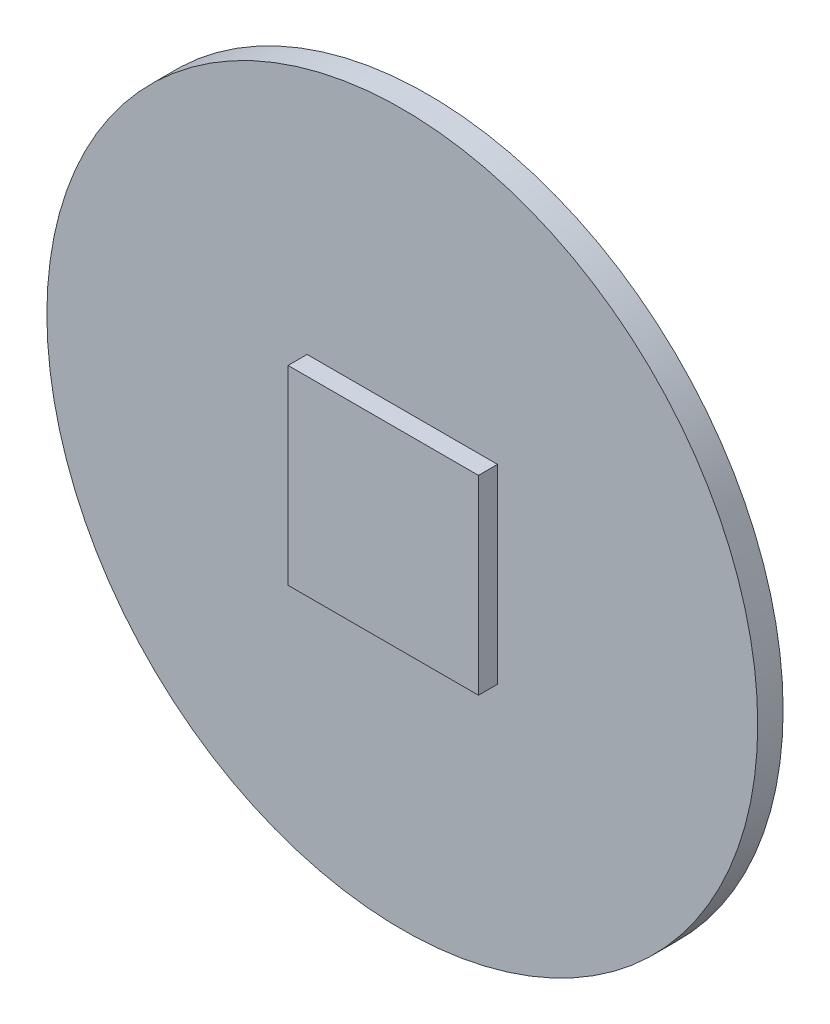
ISO-10303-21;
HEADER;
FILE_DESCRIPTION(('STEP AP214'),'2;1');
FILE_NAME('part.step','',(''),(''),'','','');
FILE_SCHEMA(('AUTOMOTIVE_DESIGN { 1 0 10303 214 1 1 1 1 }'));
ENDSEC;
DATA;
#1=APPLICATION_CONTEXT('core data for automotive mechanical design processes');
#2=APPLICATION_PROTOCOL_DEFINITION('international standard','automotive_design',2000,#1);
#3=PRODUCT_CONTEXT('',#1,'mechanical');
#4=PRODUCT('Part','Part','',(#3));
#5=PRODUCT_RELATED_PRODUCT_CATEGORY('part','',(#4));
#6=PRODUCT_DEFINITION_FORMATION('','',#4);
#7=PRODUCT_DEFINITION_CONTEXT('part definition',#1,'design');
#8=PRODUCT_DEFINITION('design','',#6,#7);
#9=PRODUCT_DEFINITION_SHAPE('','',#8);
#10=(LENGTH_UNIT() NAMED_UNIT(*) SI_UNIT(.MILLI.,.METRE.));
#11=(NAMED_UNIT(*) PLANE_ANGLE_UNIT() SI_UNIT($,.RADIAN.));
#12=(NAMED_UNIT(*) SI_UNIT($,.STERADIAN.) SOLID_ANGLE_UNIT());
#13=UNCERTAINTY_MEASURE_WITH_UNIT(LENGTH_MEASURE(1.E-05),#10,'distance_accuracy_value','');
#14=(GEOMETRIC_REPRESENTATION_CONTEXT(3) GLOBAL_UNCERTAINTY_ASSIGNED_CONTEXT((#13)) GLOBAL_UNIT_ASSIGNED_CONTEXT((#10,
#11,#12)) REPRESENTATION_CONTEXT('',''));
#15=CARTESIAN_POINT('',(0.,0.,0.));
#16=DIRECTION('',(0.,0.,1.));
#17=DIRECTION('',(1.,0.,0.));
#18=AXIS2_PLACEMENT_3D('',#15,#16,#17);
#19=CARTESIAN_POINT('',(0.,0.,0.));
#20=DIRECTION('',(0.,0.,1.));
#21=DIRECTION('',(1.,0.,0.));
#22=AXIS2_PLACEMENT_3D('',#19,#20,#21);
#23=PLANE('',#22);
#24=DIRECTION('',(0.,1.,0.));
#25=VECTOR('',#24,1.);
#26=CARTESIAN_POINT('',(-24.,-10.,0.));
#27=LINE('',#26,#25);
#28=CARTESIAN_POINT('',(-24.,-10.,0.));
#29=VERTEX_POINT('',#28);
#30=CARTESIAN_POINT('',(-24.,10.,0.));
#31=VERTEX_POINT('',#30);
#32=EDGE_CURVE('E143',#29,#31,#27,.T.);
#33=ORIENTED_EDGE('',*,*,#32,.F.);
#34=DIRECTION('',(-1.,0.,0.));
#35=VECTOR('',#34,1.);
#36=CARTESIAN_POINT('',(-14.,-10.,0.));
#37=LINE('',#36,#35);
#38=CARTESIAN_POINT('',(-14.,-10.,0.));
#39=VERTEX_POINT('',#38);
#40=EDGE_CURVE('E156',#39,#29,#37,.T.);
#41=ORIENTED_EDGE('',*,*,#40,.F.);
#42=DIRECTION('',(0.,-1.,0.));
#43=VECTOR('',#42,1.);
#44=CARTESIAN_POINT('',(-14.,-10.,0.));
#45=LINE('',#44,#43);
#46=CARTESIAN_POINT('',(-14.,10.,0.));
#47=VERTEX_POINT('',#46);
#48=EDGE_CURVE('E165',#47,#39,#45,.T.);
#49=ORIENTED_EDGE('',*,*,#48,.F.);
#50=DIRECTION('',(1.,0.,0.));
#51=VECTOR('',#50,1.);
#52=CARTESIAN_POINT('',(-14.,10.,0.));
#53=LINE('',#52,#51);
#54=EDGE_CURVE('E146',#31,#47,#53,.T.);
#55=ORIENTED_EDGE('',*,*,#54,.F.);
#56=EDGE_LOOP('',(#33,#41,#49,#55));
#57=FACE_BOUND('',#56,.T.);
#58=CARTESIAN_POINT('',(0.,0.,0.));
#59=DIRECTION('',(0.,0.,1.));
#60=DIRECTION('',(1.,0.,0.));
#61=AXIS2_PLACEMENT_3D('',#58,#59,#60);
#62=CIRCLE('',#61,28.);
#63=CARTESIAN_POINT('',(28.,0.,0.));
#64=VERTEX_POINT('',#63);
#65=EDGE_CURVE('E37',#64,#64,#62,.T.);
#66=ORIENTED_EDGE('',*,*,#65,.F.);
#67=EDGE_LOOP('',(#66));
#68=FACE_BOUND('',#67,.T.);
#69=DIRECTION('',(0.,1.,0.));
#70=VECTOR('',#69,1.);
#71=CARTESIAN_POINT('',(-7.5,-7.5,0.));
#72=LINE('',#71,#70);
#73=CARTESIAN_POINT('',(-7.5,-7.5,0.));
#74=VERTEX_POINT('',#73);
#75=CARTESIAN_POINT('',(-7.5,7.5,0.));
#76=VERTEX_POINT('',#75);
#77=EDGE_CURVE('E142',#74,#76,#72,.T.);
#78=ORIENTED_EDGE('',*,*,#77,.F.);
#79=DIRECTION('',(-1.,0.,0.));
#80=VECTOR('',#79,1.);
#81=CARTESIAN_POINT('',(7.5,-7.5,0.));
#82=LINE('',#81,#80);
#83=CARTESIAN_POINT('',(7.5,-7.5,0.));
#84=VERTEX_POINT('',#83);
#85=EDGE_CURVE('E139',#84,#74,#82,.T.);
#86=ORIENTED_EDGE('',*,*,#85,.F.);
#87=DIRECTION('',(0.,-1.,0.));
#88=VECTOR('',#87,1.);
#89=CARTESIAN_POINT('',(7.5,-7.5,0.));
#90=LINE('',#89,#88);
#91=CARTESIAN_POINT('',(7.5,7.5,0.));
#92=VERTEX_POINT('',#91);
#93=EDGE_CURVE('E53',#92,#84,#90,.T.);
#94=ORIENTED_EDGE('',*,*,#93,.F.);
#95=DIRECTION('',(1.,0.,0.));
#96=VECTOR('',#95,1.);
#97=CARTESIAN_POINT('',(7.5,7.5,0.));
#98=LINE('',#97,#96);
#99=EDGE_CURVE('E48',#76,#92,#98,.T.);
#100=ORIENTED_EDGE('',*,*,#99,.F.);
#101=EDGE_LOOP('',(#78,#86,#94,#100));
#102=FACE_BOUND('',#101,.T.);
#103=ADVANCED_FACE('F33',(#57,#68,#102),#23,.F.);
#104=CARTESIAN_POINT('',(0.,0.,2.));
#105=DIRECTION('',(0.,0.,-1.));
#106=DIRECTION('',(-1.,0.,0.));
#107=AXIS2_PLACEMENT_3D('',#104,#105,#106);
#108=CYLINDRICAL_SURFACE('',#107,28.);
#109=CARTESIAN_POINT('',(0.,0.,2.));
#110=DIRECTION('',(0.,0.,1.));
#111=DIRECTION('',(1.,0.,0.));
#112=AXIS2_PLACEMENT_3D('',#109,#110,#111);
#113=CIRCLE('',#112,28.);
#114=CARTESIAN_POINT('',(28.,0.,2.));
#115=VERTEX_POINT('',#114);
#116=EDGE_CURVE('E11',#115,#115,#113,.T.);
#117=ORIENTED_EDGE('',*,*,#116,.F.);
#118=EDGE_LOOP('',(#117));
#119=FACE_BOUND('',#118,.T.);
#120=ORIENTED_EDGE('',*,*,#65,.T.);
#121=EDGE_LOOP('',(#120));
#122=FACE_BOUND('',#121,.T.);
#123=ADVANCED_FACE('F35',(#119,#122),#108,.T.);
#124=CARTESIAN_POINT('',(0.,0.,2.));
#125=DIRECTION('',(0.,0.,1.));
#126=DIRECTION('',(1.,0.,0.));
#127=AXIS2_PLACEMENT_3D('',#124,#125,#126);
#128=PLANE('',#127);
#129=DIRECTION('',(0.,1.,0.));
#130=VECTOR('',#129,1.);
#131=CARTESIAN_POINT('',(7.5,-7.5,2.));
#132=LINE('',#131,#130);
#133=CARTESIAN_POINT('',(7.5,-7.5,2.));
#134=VERTEX_POINT('',#133);
#135=CARTESIAN_POINT('',(7.5,7.5,2.));
#136=VERTEX_POINT('',#135);
#137=EDGE_CURVE('E181',#134,#136,#132,.T.);
#138=ORIENTED_EDGE('',*,*,#137,.F.);
#139=DIRECTION('',(1.,0.,0.));
#140=VECTOR('',#139,1.);
#141=CARTESIAN_POINT('',(-7.5,-7.5,2.));
#142=LINE('',#141,#140);
#143=CARTESIAN_POINT('',(-7.5,-7.5,2.));
#144=VERTEX_POINT('',#143);
#145=EDGE_CURVE('E186',#144,#134,#142,.T.);
#146=ORIENTED_EDGE('',*,*,#145,.F.);
#147=DIRECTION('',(0.,-1.,0.));
#148=VECTOR('',#147,1.);
#149=CARTESIAN_POINT('',(-7.5,-7.5,2.));
#150=LINE('',#149,#148);
#151=CARTESIAN_POINT('',(-7.5,7.5,2.));
#152=VERTEX_POINT('',#151);
#153=EDGE_CURVE('E198',#152,#144,#150,.T.);
#154=ORIENTED_EDGE('',*,*,#153,.F.);
#155=DIRECTION('',(-1.,0.,0.));
#156=VECTOR('',#155,1.);
#157=CARTESIAN_POINT('',(-7.5,7.5,2.));
#158=LINE('',#157,#156);
#159=EDGE_CURVE('E195',#136,#152,#158,.T.);
#160=ORIENTED_EDGE('',*,*,#159,.F.);
#161=EDGE_LOOP('',(#138,#146,#154,#160));
#162=FACE_BOUND('',#161,.T.);
#163=ORIENTED_EDGE('',*,*,#116,.T.);
#164=EDGE_LOOP('',(#163));
#165=FACE_BOUND('',#164,.T.);
#166=ADVANCED_FACE('F286',(#162,#165),#128,.T.);
#167=CARTESIAN_POINT('',(7.5,-7.5,3.5));
#168=DIRECTION('',(-1.,0.,0.));
#169=DIRECTION('',(0.,0.,1.));
#170=AXIS2_PLACEMENT_3D('',#167,#168,#169);
#171=PLANE('',#170);
#172=ORIENTED_EDGE('',*,*,#137,.T.);
#173=DIRECTION('',(0.,0.,-1.));
#174=VECTOR('',#173,1.);
#175=CARTESIAN_POINT('',(7.5,7.5,3.5));
#176=LINE('',#175,#174);
#177=CARTESIAN_POINT('',(7.5,7.5,3.5));
#178=VERTEX_POINT('',#177);
#179=EDGE_CURVE('E211',#178,#136,#176,.T.);
#180=ORIENTED_EDGE('',*,*,#179,.F.);
#181=DIRECTION('',(0.,1.,0.));
#182=VECTOR('',#181,1.);
#183=CARTESIAN_POINT('',(7.5,-7.5,3.5));
#184=LINE('',#183,#182);
#185=CARTESIAN_POINT('',(7.5,-7.5,3.5));
#186=VERTEX_POINT('',#185);
#187=EDGE_CURVE('E182',#186,#178,#184,.T.);
#188=ORIENTED_EDGE('',*,*,#187,.F.);
#189=DIRECTION('',(0.,0.,-1.));
#190=VECTOR('',#189,1.);
#191=CARTESIAN_POINT('',(7.5,-7.5,3.5));
#192=LINE('',#191,#190);
#193=EDGE_CURVE('E192',#186,#134,#192,.T.);
#194=ORIENTED_EDGE('',*,*,#193,.T.);
#195=EDGE_LOOP('',(#172,#180,#188,#194));
#196=FACE_BOUND('',#195,.T.);
#197=ADVANCED_FACE('F283',(#196),#171,.F.);
#198=CARTESIAN_POINT('',(-7.5,7.5,3.5));
#199=DIRECTION('',(0.,-1.,0.));
#200=DIRECTION('',(0.,0.,-1.));
#201=AXIS2_PLACEMENT_3D('',#198,#199,#200);
#202=PLANE('',#201);
#203=ORIENTED_EDGE('',*,*,#159,.T.);
#204=DIRECTION('',(0.,0.,-1.));
#205=VECTOR('',#204,1.);
#206=CARTESIAN_POINT('',(-7.5,7.5,3.5));
#207=LINE('',#206,#205);
#208=CARTESIAN_POINT('',(-7.5,7.5,3.5));
#209=VERTEX_POINT('',#208);
#210=EDGE_CURVE('E208',#209,#152,#207,.T.);
#211=ORIENTED_EDGE('',*,*,#210,.F.);
#212=DIRECTION('',(-1.,0.,0.));
#213=VECTOR('',#212,1.);
#214=CARTESIAN_POINT('',(-7.5,7.5,3.5));
#215=LINE('',#214,#213);
#216=EDGE_CURVE('E185',#178,#209,#215,.T.);
#217=ORIENTED_EDGE('',*,*,#216,.F.);
#218=ORIENTED_EDGE('',*,*,#179,.T.);
#219=EDGE_LOOP('',(#203,#211,#217,#218));
#220=FACE_BOUND('',#219,.T.);
#221=ADVANCED_FACE('F279',(#220),#202,.F.);
#222=CARTESIAN_POINT('',(-7.5,-7.5,3.5));
#223=DIRECTION('',(1.,0.,0.));
#224=DIRECTION('',(0.,0.,-1.));
#225=AXIS2_PLACEMENT_3D('',#222,#223,#224);
#226=PLANE('',#225);
#227=ORIENTED_EDGE('',*,*,#153,.T.);
#228=DIRECTION('',(0.,0.,-1.));
#229=VECTOR('',#228,1.);
#230=CARTESIAN_POINT('',(-7.5,-7.5,3.5));
#231=LINE('',#230,#229);
#232=CARTESIAN_POINT('',(-7.5,-7.5,3.5));
#233=VERTEX_POINT('',#232);
#234=EDGE_CURVE('E205',#233,#144,#231,.T.);
#235=ORIENTED_EDGE('',*,*,#234,.F.);
#236=DIRECTION('',(0.,-1.,0.));
#237=VECTOR('',#236,1.);
#238=CARTESIAN_POINT('',(-7.5,-7.5,3.5));
#239=LINE('',#238,#237);
#240=EDGE_CURVE('E188',#209,#233,#239,.T.);
#241=ORIENTED_EDGE('',*,*,#240,.F.);
#242=ORIENTED_EDGE('',*,*,#210,.T.);
#243=EDGE_LOOP('',(#227,#235,#241,#242));
#244=FACE_BOUND('',#243,.T.);
#245=ADVANCED_FACE('F275',(#244),#226,.F.);
#246=CARTESIAN_POINT('',(-7.5,-7.5,3.5));
#247=DIRECTION('',(0.,1.,0.));
#248=DIRECTION('',(0.,0.,1.));
#249=AXIS2_PLACEMENT_3D('',#246,#247,#248);
#250=PLANE('',#249);
#251=ORIENTED_EDGE('',*,*,#145,.T.);
#252=ORIENTED_EDGE('',*,*,#193,.F.);
#253=DIRECTION('',(1.,0.,0.));
#254=VECTOR('',#253,1.);
#255=CARTESIAN_POINT('',(-7.5,-7.5,3.5));
#256=LINE('',#255,#254);
#257=EDGE_CURVE('E190',#233,#186,#256,.T.);
#258=ORIENTED_EDGE('',*,*,#257,.F.);
#259=ORIENTED_EDGE('',*,*,#234,.T.);
#260=EDGE_LOOP('',(#251,#252,#258,#259));
#261=FACE_BOUND('',#260,.T.);
#262=ADVANCED_FACE('F271',(#261),#250,.F.);
#263=CARTESIAN_POINT('',(0.,0.,3.5));
#264=DIRECTION('',(0.,0.,-1.));
#265=DIRECTION('',(-1.,0.,0.));
#266=AXIS2_PLACEMENT_3D('',#263,#264,#265);
#267=PLANE('',#266);
#268=ORIENTED_EDGE('',*,*,#187,.T.);
#269=ORIENTED_EDGE('',*,*,#216,.T.);
#270=ORIENTED_EDGE('',*,*,#240,.T.);
#271=ORIENTED_EDGE('',*,*,#257,.T.);
#272=EDGE_LOOP('',(#268,#269,#270,#271));
#273=FACE_BOUND('',#272,.T.);
#274=ADVANCED_FACE('F267',(#273),#267,.F.);
#275=CARTESIAN_POINT('',(-24.,-10.,-1.5));
#276=DIRECTION('',(1.,0.,0.));
#277=DIRECTION('',(0.,1.,0.));
#278=AXIS2_PLACEMENT_3D('',#275,#276,#277);
#279=PLANE('',#278);
#280=ORIENTED_EDGE('',*,*,#32,.T.);
#281=DIRECTION('',(0.,0.,1.));
#282=VECTOR('',#281,1.);
#283=CARTESIAN_POINT('',(-24.,10.,-1.5));
#284=LINE('',#283,#282);
#285=CARTESIAN_POINT('',(-24.,10.,-1.5));
#286=VERTEX_POINT('',#285);
#287=EDGE_CURVE('E178',#286,#31,#284,.T.);
#288=ORIENTED_EDGE('',*,*,#287,.F.);
#289=DIRECTION('',(0.,1.,0.));
#290=VECTOR('',#289,1.);
#291=CARTESIAN_POINT('',(-24.,-10.,-1.5));
#292=LINE('',#291,#290);
#293=CARTESIAN_POINT('',(-24.,-10.,-1.5));
#294=VERTEX_POINT('',#293);
#295=EDGE_CURVE('E152',#294,#286,#292,.T.);
#296=ORIENTED_EDGE('',*,*,#295,.F.);
#297=DIRECTION('',(0.,0.,1.));
#298=VECTOR('',#297,1.);
#299=CARTESIAN_POINT('',(-24.,-10.,-1.5));
#300=LINE('',#299,#298);
#301=EDGE_CURVE('E161',#294,#29,#300,.T.);
#302=ORIENTED_EDGE('',*,*,#301,.T.);
#303=EDGE_LOOP('',(#280,#288,#296,#302));
#304=FACE_BOUND('',#303,.T.);
#305=ADVANCED_FACE('F263',(#304),#279,.F.);
#306=CARTESIAN_POINT('',(-14.,10.,-1.5));
#307=DIRECTION('',(0.,-1.,0.));
#308=DIRECTION('',(0.,0.,-1.));
#309=AXIS2_PLACEMENT_3D('',#306,#307,#308);
#310=PLANE('',#309);
#311=ORIENTED_EDGE('',*,*,#54,.T.);
#312=DIRECTION('',(0.,0.,1.));
#313=VECTOR('',#312,1.);
#314=CARTESIAN_POINT('',(-14.,10.,-1.5));
#315=LINE('',#314,#313);
#316=CARTESIAN_POINT('',(-14.,10.,-1.5));
#317=VERTEX_POINT('',#316);
#318=EDGE_CURVE('E175',#317,#47,#315,.T.);
#319=ORIENTED_EDGE('',*,*,#318,.F.);
#320=DIRECTION('',(1.,0.,0.));
#321=VECTOR('',#320,1.);
#322=CARTESIAN_POINT('',(-14.,10.,-1.5));
#323=LINE('',#322,#321);
#324=EDGE_CURVE('E155',#286,#317,#323,.T.);
#325=ORIENTED_EDGE('',*,*,#324,.F.);
#326=ORIENTED_EDGE('',*,*,#287,.T.);
#327=EDGE_LOOP('',(#311,#319,#325,#326));
#328=FACE_BOUND('',#327,.T.);
#329=ADVANCED_FACE('F259',(#328),#310,.F.);
#330=CARTESIAN_POINT('',(-14.,-10.,-1.5));
#331=DIRECTION('',(-1.,0.,0.));
#332=DIRECTION('',(0.,0.,1.));
#333=AXIS2_PLACEMENT_3D('',#330,#331,#332);
#334=PLANE('',#333);
#335=ORIENTED_EDGE('',*,*,#48,.T.);
#336=DIRECTION('',(0.,0.,1.));
#337=VECTOR('',#336,1.);
#338=CARTESIAN_POINT('',(-14.,-10.,-1.5));
#339=LINE('',#338,#337);
#340=CARTESIAN_POINT('',(-14.,-10.,-1.5));
#341=VERTEX_POINT('',#340);
#342=EDGE_CURVE('E172',#341,#39,#339,.T.);
#343=ORIENTED_EDGE('',*,*,#342,.F.);
#344=DIRECTION('',(0.,-1.,0.));
#345=VECTOR('',#344,1.);
#346=CARTESIAN_POINT('',(-14.,-10.,-1.5));
#347=LINE('',#346,#345);
#348=EDGE_CURVE('E158',#317,#341,#347,.T.);
#349=ORIENTED_EDGE('',*,*,#348,.F.);
#350=ORIENTED_EDGE('',*,*,#318,.T.);
#351=EDGE_LOOP('',(#335,#343,#349,#350));
#352=FACE_BOUND('',#351,.T.);
#353=ADVANCED_FACE('F255',(#352),#334,.F.);
#354=CARTESIAN_POINT('',(-14.,-10.,-1.5));
#355=DIRECTION('',(0.,1.,0.));
#356=DIRECTION('',(0.,0.,1.));
#357=AXIS2_PLACEMENT_3D('',#354,#355,#356);
#358=PLANE('',#357);
#359=ORIENTED_EDGE('',*,*,#40,.T.);
#360=ORIENTED_EDGE('',*,*,#301,.F.);
#361=DIRECTION('',(-1.,0.,0.));
#362=VECTOR('',#361,1.);
#363=CARTESIAN_POINT('',(-14.,-10.,-1.5));
#364=LINE('',#363,#362);
#365=EDGE_CURVE('E160',#341,#294,#364,.T.);
#366=ORIENTED_EDGE('',*,*,#365,.F.);
#367=ORIENTED_EDGE('',*,*,#342,.T.);
#368=EDGE_LOOP('',(#359,#360,#366,#367));
#369=FACE_BOUND('',#368,.T.);
#370=ADVANCED_FACE('F251',(#369),#358,.F.);
#371=CARTESIAN_POINT('',(0.,0.,-1.5));
#372=DIRECTION('',(0.,0.,1.));
#373=DIRECTION('',(1.,0.,0.));
#374=AXIS2_PLACEMENT_3D('',#371,#372,#373);
#375=PLANE('',#374);
#376=ORIENTED_EDGE('',*,*,#295,.T.);
#377=ORIENTED_EDGE('',*,*,#324,.T.);
#378=ORIENTED_EDGE('',*,*,#348,.T.);
#379=ORIENTED_EDGE('',*,*,#365,.T.);
#380=EDGE_LOOP('',(#376,#377,#378,#379));
#381=FACE_BOUND('',#380,.T.);
#382=ADVANCED_FACE('F248',(#381),#375,.F.);
#383=CARTESIAN_POINT('',(-7.5,-7.5,-1.5));
#384=DIRECTION('',(1.,0.,0.));
#385=DIRECTION('',(0.,0.,-1.));
#386=AXIS2_PLACEMENT_3D('',#383,#384,#385);
#387=PLANE('',#386);
#388=ORIENTED_EDGE('',*,*,#77,.T.);
#389=DIRECTION('',(0.,0.,1.));
#390=VECTOR('',#389,1.);
#391=CARTESIAN_POINT('',(-7.5,7.5,-1.5));
#392=LINE('',#391,#390);
#393=CARTESIAN_POINT('',(-7.5,7.5,-1.5));
#394=VERTEX_POINT('',#393);
#395=EDGE_CURVE('E123',#394,#76,#392,.T.);
#396=ORIENTED_EDGE('',*,*,#395,.F.);
#397=DIRECTION('',(0.,1.,0.));
#398=VECTOR('',#397,1.);
#399=CARTESIAN_POINT('',(-7.5,-7.5,-1.5));
#400=LINE('',#399,#398);
#401=CARTESIAN_POINT('',(-7.5,-7.5,-1.5));
#402=VERTEX_POINT('',#401);
#403=EDGE_CURVE('E130',#402,#394,#400,.T.);
#404=ORIENTED_EDGE('',*,*,#403,.F.);
#405=DIRECTION('',(0.,0.,1.));
#406=VECTOR('',#405,1.);
#407=CARTESIAN_POINT('',(-7.5,-7.5,-1.5));
#408=LINE('',#407,#406);
#409=EDGE_CURVE('E226',#402,#74,#408,.T.);
#410=ORIENTED_EDGE('',*,*,#409,.T.);
#411=EDGE_LOOP('',(#388,#396,#404,#410));
#412=FACE_BOUND('',#411,.T.);
#413=ADVANCED_FACE('F141',(#412),#387,.F.);
#414=CARTESIAN_POINT('',(7.5,7.5,-1.5));
#415=DIRECTION('',(0.,-1.,0.));
#416=DIRECTION('',(0.,0.,-1.));
#417=AXIS2_PLACEMENT_3D('',#414,#415,#416);
#418=PLANE('',#417);
#419=ORIENTED_EDGE('',*,*,#99,.T.);
#420=DIRECTION('',(0.,0.,1.));
#421=VECTOR('',#420,1.);
#422=CARTESIAN_POINT('',(7.5,7.5,-1.5));
#423=LINE('',#422,#421);
#424=CARTESIAN_POINT('',(7.5,7.5,-1.5));
#425=VERTEX_POINT('',#424);
#426=EDGE_CURVE('E126',#425,#92,#423,.T.);
#427=ORIENTED_EDGE('',*,*,#426,.F.);
#428=DIRECTION('',(1.,0.,0.));
#429=VECTOR('',#428,1.);
#430=CARTESIAN_POINT('',(7.5,7.5,-1.5));
#431=LINE('',#430,#429);
#432=EDGE_CURVE('E119',#394,#425,#431,.T.);
#433=ORIENTED_EDGE('',*,*,#432,.F.);
#434=ORIENTED_EDGE('',*,*,#395,.T.);
#435=EDGE_LOOP('',(#419,#427,#433,#434));
#436=FACE_BOUND('',#435,.T.);
#437=ADVANCED_FACE('F121',(#436),#418,.F.);
#438=CARTESIAN_POINT('',(7.5,-7.5,-1.5));
#439=DIRECTION('',(-1.,0.,0.));
#440=DIRECTION('',(0.,0.,1.));
#441=AXIS2_PLACEMENT_3D('',#438,#439,#440);
#442=PLANE('',#441);
#443=ORIENTED_EDGE('',*,*,#93,.T.);
#444=DIRECTION('',(0.,0.,1.));
#445=VECTOR('',#444,1.);
#446=CARTESIAN_POINT('',(7.5,-7.5,-1.5));
#447=LINE('',#446,#445);
#448=CARTESIAN_POINT('',(7.5,-7.5,-1.5));
#449=VERTEX_POINT('',#448);
#450=EDGE_CURVE('E148',#449,#84,#447,.T.);
#451=ORIENTED_EDGE('',*,*,#450,.F.);
#452=DIRECTION('',(0.,-1.,0.));
#453=VECTOR('',#452,1.);
#454=CARTESIAN_POINT('',(7.5,-7.5,-1.5));
#455=LINE('',#454,#453);
#456=EDGE_CURVE('E129',#425,#449,#455,.T.);
#457=ORIENTED_EDGE('',*,*,#456,.F.);
#458=ORIENTED_EDGE('',*,*,#426,.T.);
#459=EDGE_LOOP('',(#443,#451,#457,#458));
#460=FACE_BOUND('',#459,.T.);
#461=ADVANCED_FACE('F235',(#460),#442,.F.);
#462=CARTESIAN_POINT('',(7.5,-7.5,-1.5));
#463=DIRECTION('',(0.,1.,0.));
#464=DIRECTION('',(0.,0.,1.));
#465=AXIS2_PLACEMENT_3D('',#462,#463,#464);
#466=PLANE('',#465);
#467=ORIENTED_EDGE('',*,*,#85,.T.);
#468=ORIENTED_EDGE('',*,*,#409,.F.);
#469=DIRECTION('',(-1.,0.,0.));
#470=VECTOR('',#469,1.);
#471=CARTESIAN_POINT('',(7.5,-7.5,-1.5));
#472=LINE('',#471,#470);
#473=EDGE_CURVE('E135',#449,#402,#472,.T.);
#474=ORIENTED_EDGE('',*,*,#473,.F.);
#475=ORIENTED_EDGE('',*,*,#450,.T.);
#476=EDGE_LOOP('',(#467,#468,#474,#475));
#477=FACE_BOUND('',#476,.T.);
#478=ADVANCED_FACE('F225',(#477),#466,.F.);
#479=CARTESIAN_POINT('',(0.,0.,-1.5));
#480=DIRECTION('',(0.,0.,1.));
#481=DIRECTION('',(1.,0.,0.));
#482=AXIS2_PLACEMENT_3D('',#479,#480,#481);
#483=PLANE('',#482);
#484=ORIENTED_EDGE('',*,*,#403,.T.);
#485=ORIENTED_EDGE('',*,*,#432,.T.);
#486=ORIENTED_EDGE('',*,*,#456,.T.);
#487=ORIENTED_EDGE('',*,*,#473,.T.);
#488=EDGE_LOOP('',(#484,#485,#486,#487));
#489=FACE_BOUND('',#488,.T.);
#490=ADVANCED_FACE('F133',(#489),#483,.F.);
#491=CLOSED_SHELL('',(#103,#123,#166,#197,#221,#245,#262,#274,#305,#329,#353,#370,#382,#413,
#437,#461,#478,#490));
#492=MANIFOLD_SOLID_BREP('B2',#491);
#493=ADVANCED_BREP_SHAPE_REPRESENTATION('',(#18,#492),#14);
#494=SHAPE_DEFINITION_REPRESENTATION(#9,#493);
ENDSEC;
END-ISO-10303-21;
